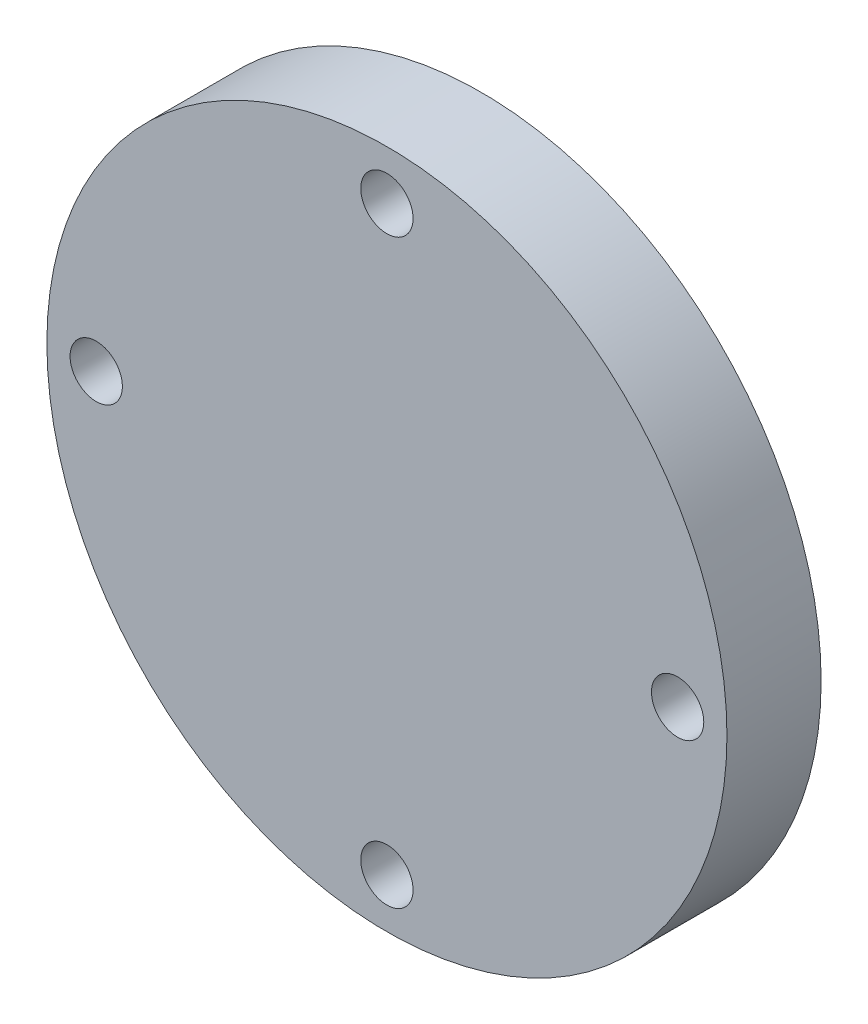
ISO-10303-21;
HEADER;
FILE_DESCRIPTION(('STEP AP214'),'2;1');
FILE_NAME('part.step','',(''),(''),'','','');
FILE_SCHEMA(('AUTOMOTIVE_DESIGN { 1 0 10303 214 1 1 1 1 }'));
ENDSEC;
DATA;
#1=APPLICATION_CONTEXT('core data for automotive mechanical design processes');
#2=APPLICATION_PROTOCOL_DEFINITION('international standard','automotive_design',2000,#1);
#3=PRODUCT_CONTEXT('',#1,'mechanical');
#4=PRODUCT('Part','Part','',(#3));
#5=PRODUCT_RELATED_PRODUCT_CATEGORY('part','',(#4));
#6=PRODUCT_DEFINITION_FORMATION('','',#4);
#7=PRODUCT_DEFINITION_CONTEXT('part definition',#1,'design');
#8=PRODUCT_DEFINITION('design','',#6,#7);
#9=PRODUCT_DEFINITION_SHAPE('','',#8);
#10=(LENGTH_UNIT() NAMED_UNIT(*) SI_UNIT(.MILLI.,.METRE.));
#11=(NAMED_UNIT(*) PLANE_ANGLE_UNIT() SI_UNIT($,.RADIAN.));
#12=(NAMED_UNIT(*) SI_UNIT($,.STERADIAN.) SOLID_ANGLE_UNIT());
#13=UNCERTAINTY_MEASURE_WITH_UNIT(LENGTH_MEASURE(1.E-05),#10,'distance_accuracy_value','');
#14=(GEOMETRIC_REPRESENTATION_CONTEXT(3) GLOBAL_UNCERTAINTY_ASSIGNED_CONTEXT((#13)) GLOBAL_UNIT_ASSIGNED_CONTEXT((#10,
#11,#12)) REPRESENTATION_CONTEXT('',''));
#15=CARTESIAN_POINT('',(0.,0.,0.));
#16=DIRECTION('',(0.,0.,1.));
#17=DIRECTION('',(1.,0.,0.));
#18=AXIS2_PLACEMENT_3D('',#15,#16,#17);
#19=CARTESIAN_POINT('',(0.,0.,93.9238815542512));
#20=DIRECTION('',(0.,0.,-1.));
#21=DIRECTION('',(-1.,0.,0.));
#22=AXIS2_PLACEMENT_3D('',#19,#20,#21);
#23=CYLINDRICAL_SURFACE('',#22,32.5);
#24=CARTESIAN_POINT('',(0.,0.,1.));
#25=DIRECTION('',(0.,0.,1.));
#26=DIRECTION('',(1.,0.,0.));
#27=AXIS2_PLACEMENT_3D('',#24,#25,#26);
#28=CIRCLE('',#27,32.5);
#29=CARTESIAN_POINT('',(32.5,0.,1.));
#30=VERTEX_POINT('',#29);
#31=EDGE_CURVE('E10',#30,#30,#28,.T.);
#32=ORIENTED_EDGE('',*,*,#31,.T.);
#33=EDGE_LOOP('',(#32));
#34=FACE_BOUND('',#33,.T.);
#35=CARTESIAN_POINT('',(0.,0.,10.));
#36=DIRECTION('',(0.,0.,1.));
#37=DIRECTION('',(1.,0.,0.));
#38=AXIS2_PLACEMENT_3D('',#35,#36,#37);
#39=CIRCLE('',#38,32.5);
#40=CARTESIAN_POINT('',(32.5,0.,10.));
#41=VERTEX_POINT('',#40);
#42=EDGE_CURVE('E47',#41,#41,#39,.T.);
#43=ORIENTED_EDGE('',*,*,#42,.F.);
#44=EDGE_LOOP('',(#43));
#45=FACE_BOUND('',#44,.T.);
#46=ADVANCED_FACE('F33',(#34,#45),#23,.T.);
#47=CARTESIAN_POINT('',(0.,0.,1.));
#48=DIRECTION('',(0.,0.,1.));
#49=DIRECTION('',(1.,0.,0.));
#50=AXIS2_PLACEMENT_3D('',#47,#48,#49);
#51=PLANE('',#50);
#52=CARTESIAN_POINT('',(-27.7830913725551,-7.45931094670027E-13,0.999999999999999));
#53=DIRECTION('',(0.,0.,1.));
#54=DIRECTION('',(1.,0.,0.));
#55=AXIS2_PLACEMENT_3D('',#52,#53,#54);
#56=CIRCLE('',#55,2.49999999999999);
#57=CARTESIAN_POINT('',(-25.2830913725551,-7.45931094670027E-13,0.999999999999999));
#58=VERTEX_POINT('',#57);
#59=EDGE_CURVE('E68',#58,#58,#56,.T.);
#60=ORIENTED_EDGE('',*,*,#59,.T.);
#61=EDGE_LOOP('',(#60));
#62=FACE_BOUND('',#61,.T.);
#63=CARTESIAN_POINT('',(1.55951640490315E-12,-27.7830913725559,0.999999999999999));
#64=DIRECTION('',(0.,0.,1.));
#65=DIRECTION('',(1.,0.,0.));
#66=AXIS2_PLACEMENT_3D('',#63,#64,#65);
#67=CIRCLE('',#66,2.5);
#68=CARTESIAN_POINT('',(2.50000000000156,-27.7830913725559,0.999999999999999));
#69=VERTEX_POINT('',#68);
#70=EDGE_CURVE('E62',#69,#69,#67,.T.);
#71=ORIENTED_EDGE('',*,*,#70,.T.);
#72=EDGE_LOOP('',(#71));
#73=FACE_BOUND('',#72,.T.);
#74=CARTESIAN_POINT('',(27.7830913725567,7.86240502677167E-13,0.999999999999999));
#75=DIRECTION('',(0.,0.,1.));
#76=DIRECTION('',(1.,0.,0.));
#77=AXIS2_PLACEMENT_3D('',#74,#75,#76);
#78=CIRCLE('',#77,2.50000000000062);
#79=CARTESIAN_POINT('',(30.2830913725573,7.86240502677167E-13,0.999999999999999));
#80=VERTEX_POINT('',#79);
#81=EDGE_CURVE('E56',#80,#80,#78,.T.);
#82=ORIENTED_EDGE('',*,*,#81,.T.);
#83=EDGE_LOOP('',(#82));
#84=FACE_BOUND('',#83,.T.);
#85=CARTESIAN_POINT('',(0.,27.7830913725559,0.999999999999999));
#86=DIRECTION('',(0.,0.,1.));
#87=DIRECTION('',(1.,0.,0.));
#88=AXIS2_PLACEMENT_3D('',#85,#86,#87);
#89=CIRCLE('',#88,2.5);
#90=CARTESIAN_POINT('',(2.50000000000003,27.7830913725559,0.999999999999999));
#91=VERTEX_POINT('',#90);
#92=EDGE_CURVE('E52',#91,#91,#89,.T.);
#93=ORIENTED_EDGE('',*,*,#92,.T.);
#94=EDGE_LOOP('',(#93));
#95=FACE_BOUND('',#94,.T.);
#96=ORIENTED_EDGE('',*,*,#31,.F.);
#97=EDGE_LOOP('',(#96));
#98=FACE_BOUND('',#97,.T.);
#99=CARTESIAN_POINT('',(0.,0.,1.));
#100=DIRECTION('',(0.,0.,1.));
#101=DIRECTION('',(1.,0.,0.));
#102=AXIS2_PLACEMENT_3D('',#99,#100,#101);
#103=CIRCLE('',#102,21.);
#104=CARTESIAN_POINT('',(21.,0.,1.));
#105=VERTEX_POINT('',#104);
#106=EDGE_CURVE('E39',#105,#105,#103,.T.);
#107=ORIENTED_EDGE('',*,*,#106,.T.);
#108=EDGE_LOOP('',(#107));
#109=FACE_BOUND('',#108,.T.);
#110=ADVANCED_FACE('F77',(#62,#73,#84,#95,#98,#109),#51,.F.);
#111=CARTESIAN_POINT('',(0.,0.,93.9238815542512));
#112=DIRECTION('',(0.,0.,-1.));
#113=DIRECTION('',(-1.,0.,0.));
#114=AXIS2_PLACEMENT_3D('',#111,#112,#113);
#115=CYLINDRICAL_SURFACE('',#114,21.);
#116=ORIENTED_EDGE('',*,*,#106,.F.);
#117=EDGE_LOOP('',(#116));
#118=FACE_BOUND('',#117,.T.);
#119=CARTESIAN_POINT('',(0.,0.,2.));
#120=DIRECTION('',(0.,0.,1.));
#121=DIRECTION('',(1.,0.,0.));
#122=AXIS2_PLACEMENT_3D('',#119,#120,#121);
#123=CIRCLE('',#122,21.);
#124=CARTESIAN_POINT('',(21.,0.,2.));
#125=VERTEX_POINT('',#124);
#126=EDGE_CURVE('E43',#125,#125,#123,.T.);
#127=ORIENTED_EDGE('',*,*,#126,.T.);
#128=EDGE_LOOP('',(#127));
#129=FACE_BOUND('',#128,.T.);
#130=ADVANCED_FACE('F91',(#118,#129),#115,.F.);
#131=CARTESIAN_POINT('',(0.,0.,10.));
#132=DIRECTION('',(0.,0.,1.));
#133=DIRECTION('',(1.,0.,0.));
#134=AXIS2_PLACEMENT_3D('',#131,#132,#133);
#135=PLANE('',#134);
#136=CARTESIAN_POINT('',(-27.7830913725551,-7.45931094670027E-13,10.));
#137=DIRECTION('',(0.,0.,1.));
#138=DIRECTION('',(1.,0.,0.));
#139=AXIS2_PLACEMENT_3D('',#136,#137,#138);
#140=CIRCLE('',#139,2.49999999999999);
#141=CARTESIAN_POINT('',(-25.2830913725551,-7.45931094670027E-13,10.));
#142=VERTEX_POINT('',#141);
#143=EDGE_CURVE('E71',#142,#142,#140,.T.);
#144=ORIENTED_EDGE('',*,*,#143,.F.);
#145=EDGE_LOOP('',(#144));
#146=FACE_BOUND('',#145,.T.);
#147=CARTESIAN_POINT('',(1.55951640490315E-12,-27.7830913725559,10.));
#148=DIRECTION('',(0.,0.,1.));
#149=DIRECTION('',(1.,0.,0.));
#150=AXIS2_PLACEMENT_3D('',#147,#148,#149);
#151=CIRCLE('',#150,2.5);
#152=CARTESIAN_POINT('',(2.50000000000156,-27.7830913725559,10.));
#153=VERTEX_POINT('',#152);
#154=EDGE_CURVE('E65',#153,#153,#151,.T.);
#155=ORIENTED_EDGE('',*,*,#154,.F.);
#156=EDGE_LOOP('',(#155));
#157=FACE_BOUND('',#156,.T.);
#158=CARTESIAN_POINT('',(27.7830913725567,7.86240502677167E-13,10.));
#159=DIRECTION('',(0.,0.,1.));
#160=DIRECTION('',(1.,0.,0.));
#161=AXIS2_PLACEMENT_3D('',#158,#159,#160);
#162=CIRCLE('',#161,2.50000000000062);
#163=CARTESIAN_POINT('',(30.2830913725573,7.86240502677167E-13,10.));
#164=VERTEX_POINT('',#163);
#165=EDGE_CURVE('E59',#164,#164,#162,.T.);
#166=ORIENTED_EDGE('',*,*,#165,.F.);
#167=EDGE_LOOP('',(#166));
#168=FACE_BOUND('',#167,.T.);
#169=CARTESIAN_POINT('',(0.,27.7830913725559,10.));
#170=DIRECTION('',(0.,0.,1.));
#171=DIRECTION('',(1.,0.,0.));
#172=AXIS2_PLACEMENT_3D('',#169,#170,#171);
#173=CIRCLE('',#172,2.5);
#174=CARTESIAN_POINT('',(2.50000000000003,27.7830913725559,10.));
#175=VERTEX_POINT('',#174);
#176=EDGE_CURVE('E53',#175,#175,#173,.T.);
#177=ORIENTED_EDGE('',*,*,#176,.F.);
#178=EDGE_LOOP('',(#177));
#179=FACE_BOUND('',#178,.T.);
#180=ORIENTED_EDGE('',*,*,#42,.T.);
#181=EDGE_LOOP('',(#180));
#182=FACE_BOUND('',#181,.T.);
#183=ADVANCED_FACE('F87',(#146,#157,#168,#179,#182),#135,.T.);
#184=CARTESIAN_POINT('',(0.,0.,2.));
#185=DIRECTION('',(0.,0.,1.));
#186=DIRECTION('',(1.,0.,0.));
#187=AXIS2_PLACEMENT_3D('',#184,#185,#186);
#188=PLANE('',#187);
#189=ORIENTED_EDGE('',*,*,#126,.F.);
#190=EDGE_LOOP('',(#189));
#191=FACE_BOUND('',#190,.T.);
#192=ADVANCED_FACE('F90',(#191),#188,.F.);
#193=CARTESIAN_POINT('',(0.,27.7830913725559,0.999999999999999));
#194=DIRECTION('',(0.,0.,1.));
#195=DIRECTION('',(1.,0.,0.));
#196=AXIS2_PLACEMENT_3D('',#193,#194,#195);
#197=CYLINDRICAL_SURFACE('',#196,2.5);
#198=ORIENTED_EDGE('',*,*,#92,.F.);
#199=EDGE_LOOP('',(#198));
#200=FACE_BOUND('',#199,.T.);
#201=ORIENTED_EDGE('',*,*,#176,.T.);
#202=EDGE_LOOP('',(#201));
#203=FACE_BOUND('',#202,.T.);
#204=ADVANCED_FACE('F112',(#200,#203),#197,.F.);
#205=CARTESIAN_POINT('',(27.7830913725567,7.86240502677167E-13,0.999999999999999));
#206=DIRECTION('',(0.,0.,1.));
#207=DIRECTION('',(1.,0.,0.));
#208=AXIS2_PLACEMENT_3D('',#205,#206,#207);
#209=CYLINDRICAL_SURFACE('',#208,2.50000000000062);
#210=ORIENTED_EDGE('',*,*,#81,.F.);
#211=EDGE_LOOP('',(#210));
#212=FACE_BOUND('',#211,.T.);
#213=ORIENTED_EDGE('',*,*,#165,.T.);
#214=EDGE_LOOP('',(#213));
#215=FACE_BOUND('',#214,.T.);
#216=ADVANCED_FACE('F117',(#212,#215),#209,.F.);
#217=CARTESIAN_POINT('',(1.55951640490315E-12,-27.7830913725559,0.999999999999999));
#218=DIRECTION('',(0.,0.,1.));
#219=DIRECTION('',(1.,0.,0.));
#220=AXIS2_PLACEMENT_3D('',#217,#218,#219);
#221=CYLINDRICAL_SURFACE('',#220,2.5);
#222=ORIENTED_EDGE('',*,*,#70,.F.);
#223=EDGE_LOOP('',(#222));
#224=FACE_BOUND('',#223,.T.);
#225=ORIENTED_EDGE('',*,*,#154,.T.);
#226=EDGE_LOOP('',(#225));
#227=FACE_BOUND('',#226,.T.);
#228=ADVANCED_FACE('F83',(#224,#227),#221,.F.);
#229=CARTESIAN_POINT('',(-27.7830913725551,-7.45931094670027E-13,0.999999999999999));
#230=DIRECTION('',(0.,0.,1.));
#231=DIRECTION('',(1.,0.,0.));
#232=AXIS2_PLACEMENT_3D('',#229,#230,#231);
#233=CYLINDRICAL_SURFACE('',#232,2.49999999999999);
#234=ORIENTED_EDGE('',*,*,#59,.F.);
#235=EDGE_LOOP('',(#234));
#236=FACE_BOUND('',#235,.T.);
#237=ORIENTED_EDGE('',*,*,#143,.T.);
#238=EDGE_LOOP('',(#237));
#239=FACE_BOUND('',#238,.T.);
#240=ADVANCED_FACE('F80',(#236,#239),#233,.F.);
#241=CLOSED_SHELL('',(#46,#110,#130,#183,#192,#204,#216,#228,#240));
#242=MANIFOLD_SOLID_BREP('B2',#241);
#243=ADVANCED_BREP_SHAPE_REPRESENTATION('',(#18,#242),#14);
#244=SHAPE_DEFINITION_REPRESENTATION(#9,#243);
ENDSEC;
END-ISO-10303-21;
